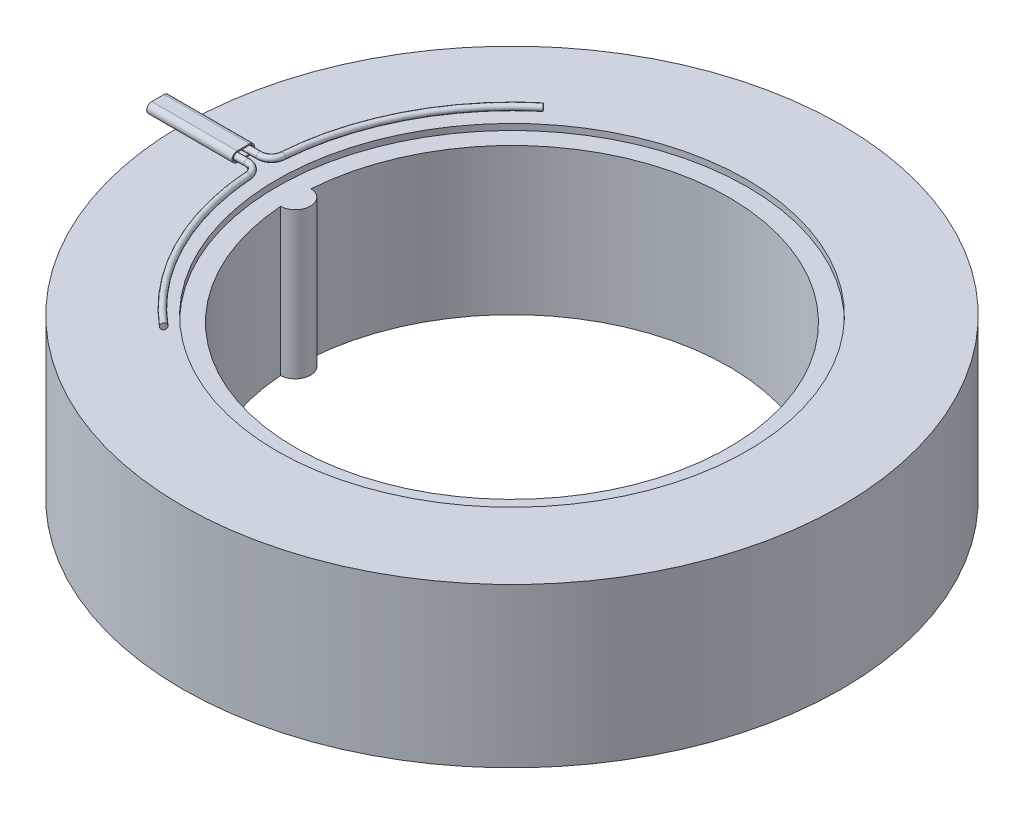
ISO-10303-21;
HEADER;
FILE_DESCRIPTION(('STEP AP214'),'2;1');
FILE_NAME('part.step','',(''),(''),'','','');
FILE_SCHEMA(('AUTOMOTIVE_DESIGN { 1 0 10303 214 1 1 1 1 }'));
ENDSEC;
DATA;
#1=APPLICATION_CONTEXT('core data for automotive mechanical design processes');
#2=APPLICATION_PROTOCOL_DEFINITION('international standard','automotive_design',2000,#1);
#3=PRODUCT_CONTEXT('',#1,'mechanical');
#4=PRODUCT('Part','Part','',(#3));
#5=PRODUCT_RELATED_PRODUCT_CATEGORY('part','',(#4));
#6=PRODUCT_DEFINITION_FORMATION('','',#4);
#7=PRODUCT_DEFINITION_CONTEXT('part definition',#1,'design');
#8=PRODUCT_DEFINITION('design','',#6,#7);
#9=PRODUCT_DEFINITION_SHAPE('','',#8);
#10=(LENGTH_UNIT() NAMED_UNIT(*) SI_UNIT(.MILLI.,.METRE.));
#11=(NAMED_UNIT(*) PLANE_ANGLE_UNIT() SI_UNIT($,.RADIAN.));
#12=(NAMED_UNIT(*) SI_UNIT($,.STERADIAN.) SOLID_ANGLE_UNIT());
#13=UNCERTAINTY_MEASURE_WITH_UNIT(LENGTH_MEASURE(1.E-05),#10,'distance_accuracy_value','');
#14=(GEOMETRIC_REPRESENTATION_CONTEXT(3) GLOBAL_UNCERTAINTY_ASSIGNED_CONTEXT((#13)) GLOBAL_UNIT_ASSIGNED_CONTEXT((#10,
#11,#12)) REPRESENTATION_CONTEXT('',''));
#15=CARTESIAN_POINT('',(0.,0.,0.));
#16=DIRECTION('',(0.,0.,1.));
#17=DIRECTION('',(1.,0.,0.));
#18=AXIS2_PLACEMENT_3D('',#15,#16,#17);
#19=CARTESIAN_POINT('',(-29.,7.,-0.499999999999997));
#20=DIRECTION('',(1.,0.,0.));
#21=DIRECTION('',(0.,0.,-1.));
#22=AXIS2_PLACEMENT_3D('',#19,#20,#21);
#23=CYLINDRICAL_SURFACE('',#22,0.414880724375139);
#24=CARTESIAN_POINT('',(-22.,7.,-0.499999999999997));
#25=DIRECTION('',(1.,0.,0.));
#26=DIRECTION('',(0.,0.,-1.));
#27=AXIS2_PLACEMENT_3D('',#24,#25,#26);
#28=CIRCLE('',#27,0.414880724375139);
#29=CARTESIAN_POINT('',(-22.,6.58511927562486,-0.499999999999997));
#30=VERTEX_POINT('',#29);
#31=CARTESIAN_POINT('',(-22.,7.41488072437514,-0.499999999999997));
#32=VERTEX_POINT('',#31);
#33=EDGE_CURVE('E185',#30,#32,#28,.T.);
#34=ORIENTED_EDGE('',*,*,#33,.F.);
#35=DIRECTION('',(1.,0.,0.));
#36=VECTOR('',#35,1.);
#37=CARTESIAN_POINT('',(-29.,6.58511927562486,-0.499999999999997));
#38=LINE('',#37,#36);
#39=CARTESIAN_POINT('',(-29.,6.58511927562486,-0.499999999999997));
#40=VERTEX_POINT('',#39);
#41=EDGE_CURVE('E13',#40,#30,#38,.T.);
#42=ORIENTED_EDGE('',*,*,#41,.F.);
#43=CARTESIAN_POINT('',(-29.,7.,-0.499999999999997));
#44=DIRECTION('',(1.,0.,0.));
#45=DIRECTION('',(0.,0.,-1.));
#46=AXIS2_PLACEMENT_3D('',#43,#44,#45);
#47=CIRCLE('',#46,0.414880724375139);
#48=CARTESIAN_POINT('',(-29.,7.41488072437514,-0.499999999999997));
#49=VERTEX_POINT('',#48);
#50=EDGE_CURVE('E189',#40,#49,#47,.T.);
#51=ORIENTED_EDGE('',*,*,#50,.T.);
#52=DIRECTION('',(1.,0.,0.));
#53=VECTOR('',#52,1.);
#54=CARTESIAN_POINT('',(-29.,7.41488072437514,-0.499999999999997));
#55=LINE('',#54,#53);
#56=EDGE_CURVE('E90',#49,#32,#55,.T.);
#57=ORIENTED_EDGE('',*,*,#56,.T.);
#58=EDGE_LOOP('',(#34,#42,#51,#57));
#59=FACE_BOUND('',#58,.T.);
#60=ADVANCED_FACE('F87',(#59),#23,.T.);
#61=CARTESIAN_POINT('',(-29.,6.58511927562486,-0.499999999999997));
#62=DIRECTION('',(0.,-1.,0.));
#63=DIRECTION('',(0.,0.,-1.));
#64=AXIS2_PLACEMENT_3D('',#61,#62,#63);
#65=PLANE('',#64);
#66=DIRECTION('',(0.,0.,-1.));
#67=VECTOR('',#66,1.);
#68=CARTESIAN_POINT('',(-22.,6.58511927562486,-0.499999999999997));
#69=LINE('',#68,#67);
#70=CARTESIAN_POINT('',(-22.,6.58511927562486,0.499999999999997));
#71=VERTEX_POINT('',#70);
#72=EDGE_CURVE('E193',#71,#30,#69,.T.);
#73=ORIENTED_EDGE('',*,*,#72,.F.);
#74=DIRECTION('',(1.,0.,0.));
#75=VECTOR('',#74,1.);
#76=CARTESIAN_POINT('',(-29.,6.58511927562486,0.499999999999997));
#77=LINE('',#76,#75);
#78=CARTESIAN_POINT('',(-29.,6.58511927562486,0.499999999999997));
#79=VERTEX_POINT('',#78);
#80=EDGE_CURVE('E95',#79,#71,#77,.T.);
#81=ORIENTED_EDGE('',*,*,#80,.F.);
#82=DIRECTION('',(0.,0.,-1.));
#83=VECTOR('',#82,1.);
#84=CARTESIAN_POINT('',(-29.,6.58511927562486,-0.499999999999997));
#85=LINE('',#84,#83);
#86=EDGE_CURVE('E199',#79,#40,#85,.T.);
#87=ORIENTED_EDGE('',*,*,#86,.T.);
#88=ORIENTED_EDGE('',*,*,#41,.T.);
#89=EDGE_LOOP('',(#73,#81,#87,#88));
#90=FACE_BOUND('',#89,.T.);
#91=ADVANCED_FACE('F225',(#90),#65,.T.);
#92=CARTESIAN_POINT('',(-29.,7.,0.499999999999997));
#93=DIRECTION('',(1.,0.,0.));
#94=DIRECTION('',(0.,0.,-1.));
#95=AXIS2_PLACEMENT_3D('',#92,#93,#94);
#96=CYLINDRICAL_SURFACE('',#95,0.41488072437514);
#97=CARTESIAN_POINT('',(-22.,7.,0.499999999999997));
#98=DIRECTION('',(1.,0.,0.));
#99=DIRECTION('',(0.,0.,-1.));
#100=AXIS2_PLACEMENT_3D('',#97,#98,#99);
#101=CIRCLE('',#100,0.41488072437514);
#102=CARTESIAN_POINT('',(-22.,7.41488072437514,0.499999999999997));
#103=VERTEX_POINT('',#102);
#104=EDGE_CURVE('E207',#103,#71,#101,.T.);
#105=ORIENTED_EDGE('',*,*,#104,.F.);
#106=DIRECTION('',(1.,0.,0.));
#107=VECTOR('',#106,1.);
#108=CARTESIAN_POINT('',(-29.,7.41488072437514,0.499999999999997));
#109=LINE('',#108,#107);
#110=CARTESIAN_POINT('',(-29.,7.41488072437514,0.499999999999997));
#111=VERTEX_POINT('',#110);
#112=EDGE_CURVE('E212',#111,#103,#109,.T.);
#113=ORIENTED_EDGE('',*,*,#112,.F.);
#114=CARTESIAN_POINT('',(-29.,7.,0.499999999999997));
#115=DIRECTION('',(1.,0.,0.));
#116=DIRECTION('',(0.,0.,-1.));
#117=AXIS2_PLACEMENT_3D('',#114,#115,#116);
#118=CIRCLE('',#117,0.41488072437514);
#119=EDGE_CURVE('E196',#111,#79,#118,.T.);
#120=ORIENTED_EDGE('',*,*,#119,.T.);
#121=ORIENTED_EDGE('',*,*,#80,.T.);
#122=EDGE_LOOP('',(#105,#113,#120,#121));
#123=FACE_BOUND('',#122,.T.);
#124=ADVANCED_FACE('F229',(#123),#96,.T.);
#125=CARTESIAN_POINT('',(-29.,7.41488072437514,-0.499999999999997));
#126=DIRECTION('',(0.,1.,0.));
#127=DIRECTION('',(0.,0.,1.));
#128=AXIS2_PLACEMENT_3D('',#125,#126,#127);
#129=PLANE('',#128);
#130=DIRECTION('',(0.,0.,1.));
#131=VECTOR('',#130,1.);
#132=CARTESIAN_POINT('',(-22.,7.41488072437514,-0.499999999999997));
#133=LINE('',#132,#131);
#134=EDGE_CURVE('E204',#32,#103,#133,.T.);
#135=ORIENTED_EDGE('',*,*,#134,.F.);
#136=ORIENTED_EDGE('',*,*,#56,.F.);
#137=DIRECTION('',(0.,0.,1.));
#138=VECTOR('',#137,1.);
#139=CARTESIAN_POINT('',(-29.,7.41488072437514,-0.499999999999997));
#140=LINE('',#139,#138);
#141=EDGE_CURVE('E192',#49,#111,#140,.T.);
#142=ORIENTED_EDGE('',*,*,#141,.T.);
#143=ORIENTED_EDGE('',*,*,#112,.T.);
#144=EDGE_LOOP('',(#135,#136,#142,#143));
#145=FACE_BOUND('',#144,.T.);
#146=ADVANCED_FACE('F220',(#145),#129,.T.);
#147=CARTESIAN_POINT('',(-29.,7.,-0.499999999999997));
#148=DIRECTION('',(1.,0.,0.));
#149=DIRECTION('',(0.,0.,-1.));
#150=AXIS2_PLACEMENT_3D('',#147,#148,#149);
#151=PLANE('',#150);
#152=DIRECTION('',(0.,0.,-1.));
#153=VECTOR('',#152,1.);
#154=CARTESIAN_POINT('',(-29.,6.68511927562486,-0.499999999999997));
#155=LINE('',#154,#153);
#156=CARTESIAN_POINT('',(-29.,6.68511927562486,0.499999999999997));
#157=VERTEX_POINT('',#156);
#158=CARTESIAN_POINT('',(-29.,6.68511927562486,-0.499999999999997));
#159=VERTEX_POINT('',#158);
#160=EDGE_CURVE('E160',#157,#159,#155,.T.);
#161=ORIENTED_EDGE('',*,*,#160,.T.);
#162=CARTESIAN_POINT('',(-29.,7.,-0.499999999999997));
#163=DIRECTION('',(1.,0.,0.));
#164=DIRECTION('',(0.,0.,-1.));
#165=AXIS2_PLACEMENT_3D('',#162,#163,#164);
#166=CIRCLE('',#165,0.314880724375139);
#167=CARTESIAN_POINT('',(-29.,7.31488072437514,-0.499999999999997));
#168=VERTEX_POINT('',#167);
#169=EDGE_CURVE('E154',#159,#168,#166,.T.);
#170=ORIENTED_EDGE('',*,*,#169,.T.);
#171=DIRECTION('',(0.,0.,1.));
#172=VECTOR('',#171,1.);
#173=CARTESIAN_POINT('',(-29.,7.31488072437514,-0.499999999999997));
#174=LINE('',#173,#172);
#175=CARTESIAN_POINT('',(-29.,7.31488072437514,0.499999999999997));
#176=VERTEX_POINT('',#175);
#177=EDGE_CURVE('E163',#168,#176,#174,.T.);
#178=ORIENTED_EDGE('',*,*,#177,.T.);
#179=CARTESIAN_POINT('',(-29.,7.,0.499999999999997));
#180=DIRECTION('',(1.,0.,0.));
#181=DIRECTION('',(0.,0.,-1.));
#182=AXIS2_PLACEMENT_3D('',#179,#180,#181);
#183=CIRCLE('',#182,0.31488072437514);
#184=EDGE_CURVE('E103',#176,#157,#183,.T.);
#185=ORIENTED_EDGE('',*,*,#184,.T.);
#186=EDGE_LOOP('',(#161,#170,#178,#185));
#187=FACE_BOUND('',#186,.T.);
#188=ORIENTED_EDGE('',*,*,#50,.F.);
#189=ORIENTED_EDGE('',*,*,#86,.F.);
#190=ORIENTED_EDGE('',*,*,#119,.F.);
#191=ORIENTED_EDGE('',*,*,#141,.F.);
#192=EDGE_LOOP('',(#188,#189,#190,#191));
#193=FACE_BOUND('',#192,.T.);
#194=ADVANCED_FACE('F167',(#187,#193),#151,.F.);
#195=CARTESIAN_POINT('',(-22.,7.,-0.499999999999997));
#196=DIRECTION('',(1.,0.,0.));
#197=DIRECTION('',(0.,0.,-1.));
#198=AXIS2_PLACEMENT_3D('',#195,#196,#197);
#199=PLANE('',#198);
#200=CARTESIAN_POINT('',(-22.,7.,-0.499999999999997));
#201=DIRECTION('',(1.,0.,0.));
#202=DIRECTION('',(0.,0.,-1.));
#203=AXIS2_PLACEMENT_3D('',#200,#201,#202);
#204=CIRCLE('',#203,0.314880724375139);
#205=CARTESIAN_POINT('',(-22.,6.68511927562486,-0.499999999999997));
#206=VERTEX_POINT('',#205);
#207=CARTESIAN_POINT('',(-22.,7.31488072437514,-0.499999999999997));
#208=VERTEX_POINT('',#207);
#209=EDGE_CURVE('E111',#206,#208,#204,.T.);
#210=ORIENTED_EDGE('',*,*,#209,.F.);
#211=DIRECTION('',(0.,0.,-1.));
#212=VECTOR('',#211,1.);
#213=CARTESIAN_POINT('',(-22.,6.68511927562486,-0.499999999999997));
#214=LINE('',#213,#212);
#215=CARTESIAN_POINT('',(-22.,6.68511927562486,0.499999999999997));
#216=VERTEX_POINT('',#215);
#217=EDGE_CURVE('E170',#216,#206,#214,.T.);
#218=ORIENTED_EDGE('',*,*,#217,.F.);
#219=CARTESIAN_POINT('',(-22.,7.,0.499999999999997));
#220=DIRECTION('',(1.,0.,0.));
#221=DIRECTION('',(0.,0.,-1.));
#222=AXIS2_PLACEMENT_3D('',#219,#220,#221);
#223=CIRCLE('',#222,0.31488072437514);
#224=CARTESIAN_POINT('',(-22.,7.31488072437514,0.499999999999997));
#225=VERTEX_POINT('',#224);
#226=EDGE_CURVE('E173',#225,#216,#223,.T.);
#227=ORIENTED_EDGE('',*,*,#226,.F.);
#228=DIRECTION('',(0.,0.,1.));
#229=VECTOR('',#228,1.);
#230=CARTESIAN_POINT('',(-22.,7.31488072437514,-0.499999999999997));
#231=LINE('',#230,#229);
#232=EDGE_CURVE('E179',#208,#225,#231,.T.);
#233=ORIENTED_EDGE('',*,*,#232,.F.);
#234=EDGE_LOOP('',(#210,#218,#227,#233));
#235=FACE_BOUND('',#234,.T.);
#236=ORIENTED_EDGE('',*,*,#33,.T.);
#237=ORIENTED_EDGE('',*,*,#134,.T.);
#238=ORIENTED_EDGE('',*,*,#104,.T.);
#239=ORIENTED_EDGE('',*,*,#72,.T.);
#240=EDGE_LOOP('',(#236,#237,#238,#239));
#241=FACE_BOUND('',#240,.T.);
#242=ADVANCED_FACE('F222',(#235,#241),#199,.T.);
#243=CARTESIAN_POINT('',(-29.,7.,-0.499999999999997));
#244=DIRECTION('',(1.,0.,0.));
#245=DIRECTION('',(0.,0.,-1.));
#246=AXIS2_PLACEMENT_3D('',#243,#244,#245);
#247=CYLINDRICAL_SURFACE('',#246,0.314880724375139);
#248=ORIENTED_EDGE('',*,*,#209,.T.);
#249=DIRECTION('',(1.,0.,0.));
#250=VECTOR('',#249,1.);
#251=CARTESIAN_POINT('',(-29.,7.31488072437514,-0.499999999999997));
#252=LINE('',#251,#250);
#253=EDGE_CURVE('E150',#168,#208,#252,.T.);
#254=ORIENTED_EDGE('',*,*,#253,.F.);
#255=ORIENTED_EDGE('',*,*,#169,.F.);
#256=DIRECTION('',(1.,0.,0.));
#257=VECTOR('',#256,1.);
#258=CARTESIAN_POINT('',(-29.,6.68511927562486,-0.499999999999997));
#259=LINE('',#258,#257);
#260=EDGE_CURVE('E183',#159,#206,#259,.T.);
#261=ORIENTED_EDGE('',*,*,#260,.T.);
#262=EDGE_LOOP('',(#248,#254,#255,#261));
#263=FACE_BOUND('',#262,.T.);
#264=ADVANCED_FACE('F152',(#263),#247,.F.);
#265=CARTESIAN_POINT('',(-29.,6.68511927562486,-0.499999999999997));
#266=DIRECTION('',(0.,-1.,0.));
#267=DIRECTION('',(0.,0.,-1.));
#268=AXIS2_PLACEMENT_3D('',#265,#266,#267);
#269=PLANE('',#268);
#270=ORIENTED_EDGE('',*,*,#217,.T.);
#271=ORIENTED_EDGE('',*,*,#260,.F.);
#272=ORIENTED_EDGE('',*,*,#160,.F.);
#273=DIRECTION('',(1.,0.,0.));
#274=VECTOR('',#273,1.);
#275=CARTESIAN_POINT('',(-29.,6.68511927562486,0.499999999999997));
#276=LINE('',#275,#274);
#277=EDGE_CURVE('E186',#157,#216,#276,.T.);
#278=ORIENTED_EDGE('',*,*,#277,.T.);
#279=EDGE_LOOP('',(#270,#271,#272,#278));
#280=FACE_BOUND('',#279,.T.);
#281=ADVANCED_FACE('F280',(#280),#269,.F.);
#282=CARTESIAN_POINT('',(-29.,7.,0.499999999999997));
#283=DIRECTION('',(1.,0.,0.));
#284=DIRECTION('',(0.,0.,-1.));
#285=AXIS2_PLACEMENT_3D('',#282,#283,#284);
#286=CYLINDRICAL_SURFACE('',#285,0.31488072437514);
#287=ORIENTED_EDGE('',*,*,#226,.T.);
#288=ORIENTED_EDGE('',*,*,#277,.F.);
#289=ORIENTED_EDGE('',*,*,#184,.F.);
#290=DIRECTION('',(1.,0.,0.));
#291=VECTOR('',#290,1.);
#292=CARTESIAN_POINT('',(-29.,7.31488072437514,0.499999999999997));
#293=LINE('',#292,#291);
#294=EDGE_CURVE('E159',#176,#225,#293,.T.);
#295=ORIENTED_EDGE('',*,*,#294,.T.);
#296=EDGE_LOOP('',(#287,#288,#289,#295));
#297=FACE_BOUND('',#296,.T.);
#298=ADVANCED_FACE('F289',(#297),#286,.F.);
#299=CARTESIAN_POINT('',(-29.,7.31488072437514,-0.499999999999997));
#300=DIRECTION('',(0.,1.,0.));
#301=DIRECTION('',(0.,0.,1.));
#302=AXIS2_PLACEMENT_3D('',#299,#300,#301);
#303=PLANE('',#302);
#304=ORIENTED_EDGE('',*,*,#232,.T.);
#305=ORIENTED_EDGE('',*,*,#294,.F.);
#306=ORIENTED_EDGE('',*,*,#177,.F.);
#307=ORIENTED_EDGE('',*,*,#253,.T.);
#308=EDGE_LOOP('',(#304,#305,#306,#307));
#309=FACE_BOUND('',#308,.T.);
#310=ADVANCED_FACE('F164',(#309),#303,.F.);
#311=CLOSED_SHELL('',(#60,#91,#124,#146,#194,#242,#264,#281,#298,#310));
#312=MANIFOLD_SOLID_BREP('B2',#311);
#313=CARTESIAN_POINT('',(-25.807382336069,7.,0.499999999999997));
#314=DIRECTION('',(-1.,0.,0.));
#315=DIRECTION('',(0.,0.,-1.));
#316=AXIS2_PLACEMENT_3D('',#313,#314,#315);
#317=PLANE('',#316);
#318=CARTESIAN_POINT('',(-25.807382336069,7.,0.499999999999997));
#319=DIRECTION('',(1.,0.,0.));
#320=DIRECTION('',(0.,0.,-1.));
#321=AXIS2_PLACEMENT_3D('',#318,#319,#320);
#322=CIRCLE('',#321,0.25);
#323=CARTESIAN_POINT('',(-25.807382336069,7.,0.249999999999997));
#324=VERTEX_POINT('',#323);
#325=EDGE_CURVE('E344',#324,#324,#322,.T.);
#326=ORIENTED_EDGE('',*,*,#325,.F.);
#327=EDGE_LOOP('',(#326));
#328=FACE_BOUND('',#327,.T.);
#329=ADVANCED_FACE('F332',(#328),#317,.T.);
#330=CARTESIAN_POINT('',(-12.9841026207754,7.,15.5394845195448));
#331=DIRECTION('',(-0.767381951582462,0.,-0.641190252877796));
#332=DIRECTION('',(0.641190252877796,0.,-0.767381951582462));
#333=AXIS2_PLACEMENT_3D('',#330,#331,#332);
#334=PLANE('',#333);
#335=CARTESIAN_POINT('',(-12.9841026207754,7.,15.5394845195448));
#336=DIRECTION('',(0.767381951582462,0.,0.641190252877796));
#337=DIRECTION('',(0.641190252877796,0.,-0.767381951582462));
#338=AXIS2_PLACEMENT_3D('',#335,#336,#337);
#339=CIRCLE('',#338,0.25);
#340=CARTESIAN_POINT('',(-12.8238050575559,7.,15.3476390316492));
#341=VERTEX_POINT('',#340);
#342=EDGE_CURVE('E85',#341,#341,#339,.T.);
#343=ORIENTED_EDGE('',*,*,#342,.T.);
#344=EDGE_LOOP('',(#343));
#345=FACE_BOUND('',#344,.T.);
#346=ADVANCED_FACE('F347',(#345),#334,.F.);
#347=CARTESIAN_POINT('',(-25.807382336069,7.,0.499999999999997));
#348=DIRECTION('',(1.,0.,0.));
#349=DIRECTION('',(0.,0.,1.));
#350=AXIS2_PLACEMENT_3D('',#347,#348,#349);
#351=CYLINDRICAL_SURFACE('',#350,0.25);
#352=CARTESIAN_POINT('',(-21.1969927112315,7.,0.499999999999997));
#353=DIRECTION('',(1.,0.,0.));
#354=DIRECTION('',(0.,0.,-1.));
#355=AXIS2_PLACEMENT_3D('',#352,#353,#354);
#356=CIRCLE('',#355,0.25);
#357=CARTESIAN_POINT('',(-21.1969927112315,7.,0.249999999999997));
#358=VERTEX_POINT('',#357);
#359=EDGE_CURVE('E357',#358,#358,#356,.T.);
#360=ORIENTED_EDGE('',*,*,#359,.F.);
#361=EDGE_LOOP('',(#360));
#362=FACE_BOUND('',#361,.T.);
#363=ORIENTED_EDGE('',*,*,#325,.T.);
#364=EDGE_LOOP('',(#363));
#365=FACE_BOUND('',#364,.T.);
#366=ADVANCED_FACE('F364',(#362,#365),#351,.T.);
#367=CARTESIAN_POINT('',(-21.1969927112315,7.,1.5));
#368=DIRECTION('',(0.,1.,0.));
#369=DIRECTION('',(0.,0.,-1.));
#370=AXIS2_PLACEMENT_3D('',#367,#368,#369);
#371=TOROIDAL_SURFACE('',#370,1.,0.25);
#372=CARTESIAN_POINT('',(-20.1994871718794,7.,1.42941176470588));
#373=DIRECTION('',(0.070588235294119,0.,0.997505539352069));
#374=DIRECTION('',(0.997505539352069,0.,-0.0705882352941191));
#375=AXIS2_PLACEMENT_3D('',#372,#373,#374);
#376=CIRCLE('',#375,0.25);
#377=CARTESIAN_POINT('',(-19.9501107870414,7.,1.41176470588235));
#378=VERTEX_POINT('',#377);
#379=EDGE_CURVE('E339',#378,#378,#376,.T.);
#380=CARTESIAN_POINT('',(-21.1969927112315,7.,1.5));
#381=DIRECTION('',(0.,1.,0.));
#382=DIRECTION('',(0.,0.,-1.));
#383=AXIS2_PLACEMENT_3D('',#380,#381,#382);
#384=CIRCLE('',#383,1.25);
#385=EDGE_CURVE('',#378,#358,#384,.T.);
#386=ORIENTED_EDGE('',*,*,#379,.F.);
#387=ORIENTED_EDGE('',*,*,#359,.T.);
#388=ORIENTED_EDGE('',*,*,#385,.T.);
#389=ORIENTED_EDGE('',*,*,#385,.F.);
#390=EDGE_LOOP('',(#386,#388,#387,#389));
#391=FACE_BOUND('',#390,.T.);
#392=ADVANCED_FACE('F352',(#391),#371,.T.);
#393=CARTESIAN_POINT('',(0.,7.,0.));
#394=DIRECTION('',(0.,-1.,0.));
#395=DIRECTION('',(0.,0.,1.));
#396=AXIS2_PLACEMENT_3D('',#393,#394,#395);
#397=TOROIDAL_SURFACE('',#396,20.25,0.25);
#398=ORIENTED_EDGE('',*,*,#342,.F.);
#399=EDGE_LOOP('',(#398));
#400=FACE_BOUND('',#399,.T.);
#401=ORIENTED_EDGE('',*,*,#379,.T.);
#402=EDGE_LOOP('',(#401));
#403=FACE_BOUND('',#402,.T.);
#404=ADVANCED_FACE('F349',(#400,#403),#397,.T.);
#405=CLOSED_SHELL('',(#329,#346,#366,#392,#404));
#406=MANIFOLD_SOLID_BREP('B7',#405);
#407=CARTESIAN_POINT('',(-25.807382336069,7.,-0.499999999999997));
#408=DIRECTION('',(-1.,0.,0.));
#409=DIRECTION('',(0.,0.,1.));
#410=AXIS2_PLACEMENT_3D('',#407,#408,#409);
#411=PLANE('',#410);
#412=CARTESIAN_POINT('',(-25.807382336069,7.,-0.499999999999997));
#413=DIRECTION('',(-1.,0.,0.));
#414=DIRECTION('',(0.,0.,1.));
#415=AXIS2_PLACEMENT_3D('',#412,#413,#414);
#416=CIRCLE('',#415,0.25);
#417=CARTESIAN_POINT('',(-25.807382336069,7.,-0.249999999999997));
#418=VERTEX_POINT('',#417);
#419=EDGE_CURVE('E426',#418,#418,#416,.T.);
#420=ORIENTED_EDGE('',*,*,#419,.T.);
#421=EDGE_LOOP('',(#420));
#422=FACE_BOUND('',#421,.T.);
#423=ADVANCED_FACE('F414',(#422),#411,.T.);
#424=CARTESIAN_POINT('',(-12.9841026207754,7.,-15.5394845195448));
#425=DIRECTION('',(-0.767381951582462,0.,0.641190252877796));
#426=DIRECTION('',(0.641190252877796,0.,0.767381951582462));
#427=AXIS2_PLACEMENT_3D('',#424,#425,#426);
#428=PLANE('',#427);
#429=CARTESIAN_POINT('',(-12.9841026207754,7.,-15.5394845195448));
#430=DIRECTION('',(-0.767381951582462,0.,0.641190252877796));
#431=DIRECTION('',(0.641190252877796,0.,0.767381951582462));
#432=AXIS2_PLACEMENT_3D('',#429,#430,#431);
#433=CIRCLE('',#432,0.25);
#434=CARTESIAN_POINT('',(-12.8238050575559,7.,-15.3476390316492));
#435=VERTEX_POINT('',#434);
#436=EDGE_CURVE('E330',#435,#435,#433,.T.);
#437=ORIENTED_EDGE('',*,*,#436,.F.);
#438=EDGE_LOOP('',(#437));
#439=FACE_BOUND('',#438,.T.);
#440=ADVANCED_FACE('F432',(#439),#428,.F.);
#441=CARTESIAN_POINT('',(-25.807382336069,7.,-0.499999999999997));
#442=DIRECTION('',(1.,0.,0.));
#443=DIRECTION('',(0.,0.,-1.));
#444=AXIS2_PLACEMENT_3D('',#441,#442,#443);
#445=CYLINDRICAL_SURFACE('',#444,0.25);
#446=CARTESIAN_POINT('',(-21.1969927112315,7.,-0.499999999999997));
#447=DIRECTION('',(-1.,0.,0.));
#448=DIRECTION('',(0.,0.,1.));
#449=AXIS2_PLACEMENT_3D('',#446,#447,#448);
#450=CIRCLE('',#449,0.25);
#451=CARTESIAN_POINT('',(-21.1969927112315,7.,-0.249999999999997));
#452=VERTEX_POINT('',#451);
#453=EDGE_CURVE('E457',#452,#452,#450,.T.);
#454=ORIENTED_EDGE('',*,*,#453,.T.);
#455=EDGE_LOOP('',(#454));
#456=FACE_BOUND('',#455,.T.);
#457=ORIENTED_EDGE('',*,*,#419,.F.);
#458=EDGE_LOOP('',(#457));
#459=FACE_BOUND('',#458,.T.);
#460=ADVANCED_FACE('F434',(#456,#459),#445,.T.);
#461=CARTESIAN_POINT('',(-21.1969927112315,7.,-1.5));
#462=DIRECTION('',(0.,1.,0.));
#463=DIRECTION('',(0.,0.,1.));
#464=AXIS2_PLACEMENT_3D('',#461,#462,#463);
#465=TOROIDAL_SURFACE('',#464,1.,0.25);
#466=CARTESIAN_POINT('',(-20.1994871718794,7.,-1.42941176470588));
#467=DIRECTION('',(-0.070588235294119,0.,0.997505539352069));
#468=DIRECTION('',(0.997505539352069,0.,0.0705882352941191));
#469=AXIS2_PLACEMENT_3D('',#466,#467,#468);
#470=CIRCLE('',#469,0.25);
#471=CARTESIAN_POINT('',(-19.9501107870414,7.,-1.41176470588235));
#472=VERTEX_POINT('',#471);
#473=EDGE_CURVE('E421',#472,#472,#470,.T.);
#474=CARTESIAN_POINT('',(-21.1969927112315,7.,-1.5));
#475=DIRECTION('',(0.,1.,0.));
#476=DIRECTION('',(0.,0.,1.));
#477=AXIS2_PLACEMENT_3D('',#474,#475,#476);
#478=CIRCLE('',#477,1.25);
#479=EDGE_CURVE('',#452,#472,#478,.T.);
#480=ORIENTED_EDGE('',*,*,#453,.F.);
#481=ORIENTED_EDGE('',*,*,#473,.T.);
#482=ORIENTED_EDGE('',*,*,#479,.T.);
#483=ORIENTED_EDGE('',*,*,#479,.F.);
#484=EDGE_LOOP('',(#480,#482,#481,#483));
#485=FACE_BOUND('',#484,.T.);
#486=ADVANCED_FACE('F439',(#485),#465,.T.);
#487=CARTESIAN_POINT('',(0.,7.,0.));
#488=DIRECTION('',(0.,-1.,0.));
#489=DIRECTION('',(0.,0.,-1.));
#490=AXIS2_PLACEMENT_3D('',#487,#488,#489);
#491=TOROIDAL_SURFACE('',#490,20.25,0.25);
#492=ORIENTED_EDGE('',*,*,#436,.T.);
#493=EDGE_LOOP('',(#492));
#494=FACE_BOUND('',#493,.T.);
#495=ORIENTED_EDGE('',*,*,#473,.F.);
#496=EDGE_LOOP('',(#495));
#497=FACE_BOUND('',#496,.T.);
#498=ADVANCED_FACE('F429',(#494,#497),#491,.T.);
#499=CLOSED_SHELL('',(#423,#440,#460,#486,#498));
#500=MANIFOLD_SOLID_BREP('B79',#499);
#501=CARTESIAN_POINT('',(0.,0.,0.));
#502=DIRECTION('',(0.,1.,0.));
#503=DIRECTION('',(0.,0.,1.));
#504=AXIS2_PLACEMENT_3D('',#501,#502,#503);
#505=CYLINDRICAL_SURFACE('',#504,19.25);
#506=CARTESIAN_POINT('',(0.,6.5,0.));
#507=DIRECTION('',(0.,1.,0.));
#508=DIRECTION('',(0.,0.,1.));
#509=AXIS2_PLACEMENT_3D('',#506,#507,#508);
#510=CIRCLE('',#509,19.25);
#511=CARTESIAN_POINT('',(0.,6.5,19.25));
#512=VERTEX_POINT('',#511);
#513=EDGE_CURVE('E517',#512,#512,#510,.T.);
#514=ORIENTED_EDGE('',*,*,#513,.T.);
#515=EDGE_LOOP('',(#514));
#516=FACE_BOUND('',#515,.T.);
#517=CARTESIAN_POINT('',(0.,-6.5,0.));
#518=DIRECTION('',(0.,1.,0.));
#519=DIRECTION('',(0.,0.,1.));
#520=AXIS2_PLACEMENT_3D('',#517,#518,#519);
#521=CIRCLE('',#520,19.25);
#522=CARTESIAN_POINT('',(0.,-6.5,19.25));
#523=VERTEX_POINT('',#522);
#524=EDGE_CURVE('E413',#523,#523,#521,.T.);
#525=ORIENTED_EDGE('',*,*,#524,.F.);
#526=EDGE_LOOP('',(#525));
#527=FACE_BOUND('',#526,.T.);
#528=ADVANCED_FACE('F503',(#516,#527),#505,.F.);
#529=CARTESIAN_POINT('',(-19.25,-6.5,0.));
#530=DIRECTION('',(0.,-1.,0.));
#531=DIRECTION('',(0.,0.,-1.));
#532=AXIS2_PLACEMENT_3D('',#529,#530,#531);
#533=PLANE('',#532);
#534=ORIENTED_EDGE('',*,*,#524,.T.);
#535=EDGE_LOOP('',(#534));
#536=FACE_BOUND('',#535,.T.);
#537=CARTESIAN_POINT('',(0.,-6.5,0.));
#538=DIRECTION('',(0.,1.,0.));
#539=DIRECTION('',(0.,0.,1.));
#540=AXIS2_PLACEMENT_3D('',#537,#538,#539);
#541=CIRCLE('',#540,27.);
#542=CARTESIAN_POINT('',(0.,-6.5,27.));
#543=VERTEX_POINT('',#542);
#544=EDGE_CURVE('E509',#543,#543,#541,.T.);
#545=ORIENTED_EDGE('',*,*,#544,.F.);
#546=EDGE_LOOP('',(#545));
#547=FACE_BOUND('',#546,.T.);
#548=ADVANCED_FACE('F533',(#536,#547),#533,.T.);
#549=CARTESIAN_POINT('',(0.,0.,0.));
#550=DIRECTION('',(0.,1.,0.));
#551=DIRECTION('',(0.,0.,1.));
#552=AXIS2_PLACEMENT_3D('',#549,#550,#551);
#553=CYLINDRICAL_SURFACE('',#552,27.);
#554=ORIENTED_EDGE('',*,*,#544,.T.);
#555=EDGE_LOOP('',(#554));
#556=FACE_BOUND('',#555,.T.);
#557=CARTESIAN_POINT('',(0.,6.5,0.));
#558=DIRECTION('',(0.,1.,0.));
#559=DIRECTION('',(0.,0.,1.));
#560=AXIS2_PLACEMENT_3D('',#557,#558,#559);
#561=CIRCLE('',#560,27.);
#562=CARTESIAN_POINT('',(0.,6.5,27.));
#563=VERTEX_POINT('',#562);
#564=EDGE_CURVE('E513',#563,#563,#561,.T.);
#565=ORIENTED_EDGE('',*,*,#564,.F.);
#566=EDGE_LOOP('',(#565));
#567=FACE_BOUND('',#566,.T.);
#568=ADVANCED_FACE('F527',(#556,#567),#553,.T.);
#569=CARTESIAN_POINT('',(-19.25,6.5,0.));
#570=DIRECTION('',(0.,1.,0.));
#571=DIRECTION('',(0.,0.,1.));
#572=AXIS2_PLACEMENT_3D('',#569,#570,#571);
#573=PLANE('',#572);
#574=ORIENTED_EDGE('',*,*,#564,.T.);
#575=EDGE_LOOP('',(#574));
#576=FACE_BOUND('',#575,.T.);
#577=ORIENTED_EDGE('',*,*,#513,.F.);
#578=EDGE_LOOP('',(#577));
#579=FACE_BOUND('',#578,.T.);
#580=ADVANCED_FACE('F525',(#576,#579),#573,.T.);
#581=CLOSED_SHELL('',(#528,#548,#568,#580));
#582=MANIFOLD_SOLID_BREP('B324',#581);
#583=CARTESIAN_POINT('',(0.,0.,0.));
#584=DIRECTION('',(0.,1.,0.));
#585=DIRECTION('',(0.,0.,1.));
#586=AXIS2_PLACEMENT_3D('',#583,#584,#585);
#587=CYLINDRICAL_SURFACE('',#586,17.75);
#588=CARTESIAN_POINT('',(0.,-6.,0.));
#589=DIRECTION('',(0.,1.,0.));
#590=DIRECTION('',(0.,0.,1.));
#591=AXIS2_PLACEMENT_3D('',#588,#589,#590);
#592=CIRCLE('',#591,17.75);
#593=CARTESIAN_POINT('',(-17.705985915493,-6.,1.24922486381156));
#594=VERTEX_POINT('',#593);
#595=CARTESIAN_POINT('',(-17.705985915493,-6.,-1.24922486381156));
#596=VERTEX_POINT('',#595);
#597=EDGE_CURVE('E601',#594,#596,#592,.T.);
#598=ORIENTED_EDGE('',*,*,#597,.F.);
#599=DIRECTION('',(0.,-1.,0.));
#600=VECTOR('',#599,1.);
#601=CARTESIAN_POINT('',(-17.705985915493,0.,1.24922486381156));
#602=LINE('',#601,#600);
#603=CARTESIAN_POINT('',(-17.705985915493,6.,1.24922486381156));
#604=VERTEX_POINT('',#603);
#605=EDGE_CURVE('E501',#594,#604,#602,.F.);
#606=ORIENTED_EDGE('',*,*,#605,.T.);
#607=CARTESIAN_POINT('',(0.,6.,0.));
#608=DIRECTION('',(0.,1.,0.));
#609=DIRECTION('',(0.,0.,1.));
#610=AXIS2_PLACEMENT_3D('',#607,#608,#609);
#611=CIRCLE('',#610,17.75);
#612=CARTESIAN_POINT('',(-17.705985915493,6.,-1.24922486381156));
#613=VERTEX_POINT('',#612);
#614=EDGE_CURVE('E603',#604,#613,#611,.T.);
#615=ORIENTED_EDGE('',*,*,#614,.T.);
#616=DIRECTION('',(0.,-1.,0.));
#617=VECTOR('',#616,1.);
#618=CARTESIAN_POINT('',(-17.705985915493,0.,-1.24922486381156));
#619=LINE('',#618,#617);
#620=EDGE_CURVE('E578',#613,#596,#619,.T.);
#621=ORIENTED_EDGE('',*,*,#620,.T.);
#622=EDGE_LOOP('',(#598,#606,#615,#621));
#623=FACE_BOUND('',#622,.T.);
#624=ADVANCED_FACE('F570',(#623),#587,.F.);
#625=CARTESIAN_POINT('',(-17.75,6.,0.));
#626=DIRECTION('',(0.,1.,0.));
#627=DIRECTION('',(0.,0.,1.));
#628=AXIS2_PLACEMENT_3D('',#625,#626,#627);
#629=PLANE('',#628);
#630=CARTESIAN_POINT('',(0.,6.,0.));
#631=DIRECTION('',(0.,1.,0.));
#632=DIRECTION('',(0.,0.,1.));
#633=AXIS2_PLACEMENT_3D('',#630,#631,#632);
#634=CIRCLE('',#633,19.25);
#635=CARTESIAN_POINT('',(0.,6.,19.25));
#636=VERTEX_POINT('',#635);
#637=EDGE_CURVE('E604',#636,#636,#634,.T.);
#638=ORIENTED_EDGE('',*,*,#637,.T.);
#639=EDGE_LOOP('',(#638));
#640=FACE_BOUND('',#639,.T.);
#641=ORIENTED_EDGE('',*,*,#614,.F.);
#642=CARTESIAN_POINT('',(-17.75,6.,0.));
#643=DIRECTION('',(0.,1.,0.));
#644=DIRECTION('',(0.,0.,1.));
#645=AXIS2_PLACEMENT_3D('',#642,#643,#644);
#646=CIRCLE('',#645,1.25);
#647=EDGE_CURVE('E597',#604,#613,#646,.T.);
#648=ORIENTED_EDGE('',*,*,#647,.T.);
#649=EDGE_LOOP('',(#641,#648));
#650=FACE_BOUND('',#649,.T.);
#651=ADVANCED_FACE('F572',(#640,#650),#629,.T.);
#652=CARTESIAN_POINT('',(0.,0.,0.));
#653=DIRECTION('',(0.,1.,0.));
#654=DIRECTION('',(0.,0.,1.));
#655=AXIS2_PLACEMENT_3D('',#652,#653,#654);
#656=CYLINDRICAL_SURFACE('',#655,19.25);
#657=CARTESIAN_POINT('',(0.,-6.,0.));
#658=DIRECTION('',(0.,1.,0.));
#659=DIRECTION('',(0.,0.,1.));
#660=AXIS2_PLACEMENT_3D('',#657,#658,#659);
#661=CIRCLE('',#660,19.25);
#662=CARTESIAN_POINT('',(0.,-6.,19.25));
#663=VERTEX_POINT('',#662);
#664=EDGE_CURVE('E607',#663,#663,#661,.T.);
#665=ORIENTED_EDGE('',*,*,#664,.T.);
#666=EDGE_LOOP('',(#665));
#667=FACE_BOUND('',#666,.T.);
#668=ORIENTED_EDGE('',*,*,#637,.F.);
#669=EDGE_LOOP('',(#668));
#670=FACE_BOUND('',#669,.T.);
#671=ADVANCED_FACE('F619',(#667,#670),#656,.T.);
#672=CARTESIAN_POINT('',(-19.25,-6.,0.));
#673=DIRECTION('',(0.,-1.,0.));
#674=DIRECTION('',(0.,0.,-1.));
#675=AXIS2_PLACEMENT_3D('',#672,#673,#674);
#676=PLANE('',#675);
#677=ORIENTED_EDGE('',*,*,#597,.T.);
#678=CARTESIAN_POINT('',(-17.75,-6.,0.));
#679=DIRECTION('',(0.,-1.,0.));
#680=DIRECTION('',(0.,0.,-1.));
#681=AXIS2_PLACEMENT_3D('',#678,#679,#680);
#682=CIRCLE('',#681,1.25);
#683=EDGE_CURVE('E584',#594,#596,#682,.F.);
#684=ORIENTED_EDGE('',*,*,#683,.F.);
#685=EDGE_LOOP('',(#677,#684));
#686=FACE_BOUND('',#685,.T.);
#687=ORIENTED_EDGE('',*,*,#664,.F.);
#688=EDGE_LOOP('',(#687));
#689=FACE_BOUND('',#688,.T.);
#690=ADVANCED_FACE('F605',(#686,#689),#676,.T.);
#691=CARTESIAN_POINT('',(-17.75,9.53553390593274,0.));
#692=DIRECTION('',(0.,-1.,0.));
#693=DIRECTION('',(0.,0.,-1.));
#694=AXIS2_PLACEMENT_3D('',#691,#692,#693);
#695=CYLINDRICAL_SURFACE('',#694,1.25);
#696=ORIENTED_EDGE('',*,*,#605,.F.);
#697=ORIENTED_EDGE('',*,*,#683,.T.);
#698=ORIENTED_EDGE('',*,*,#620,.F.);
#699=ORIENTED_EDGE('',*,*,#647,.F.);
#700=EDGE_LOOP('',(#696,#697,#698,#699));
#701=FACE_BOUND('',#700,.T.);
#702=ADVANCED_FACE('F595',(#701),#695,.T.);
#703=CLOSED_SHELL('',(#624,#651,#671,#690,#702));
#704=MANIFOLD_SOLID_BREP('B408',#703);
#705=ADVANCED_BREP_SHAPE_REPRESENTATION('',(#18,#312,#406,#500,#582,#704),#14);
#706=SHAPE_DEFINITION_REPRESENTATION(#9,#705);
ENDSEC;
END-ISO-10303-21;
